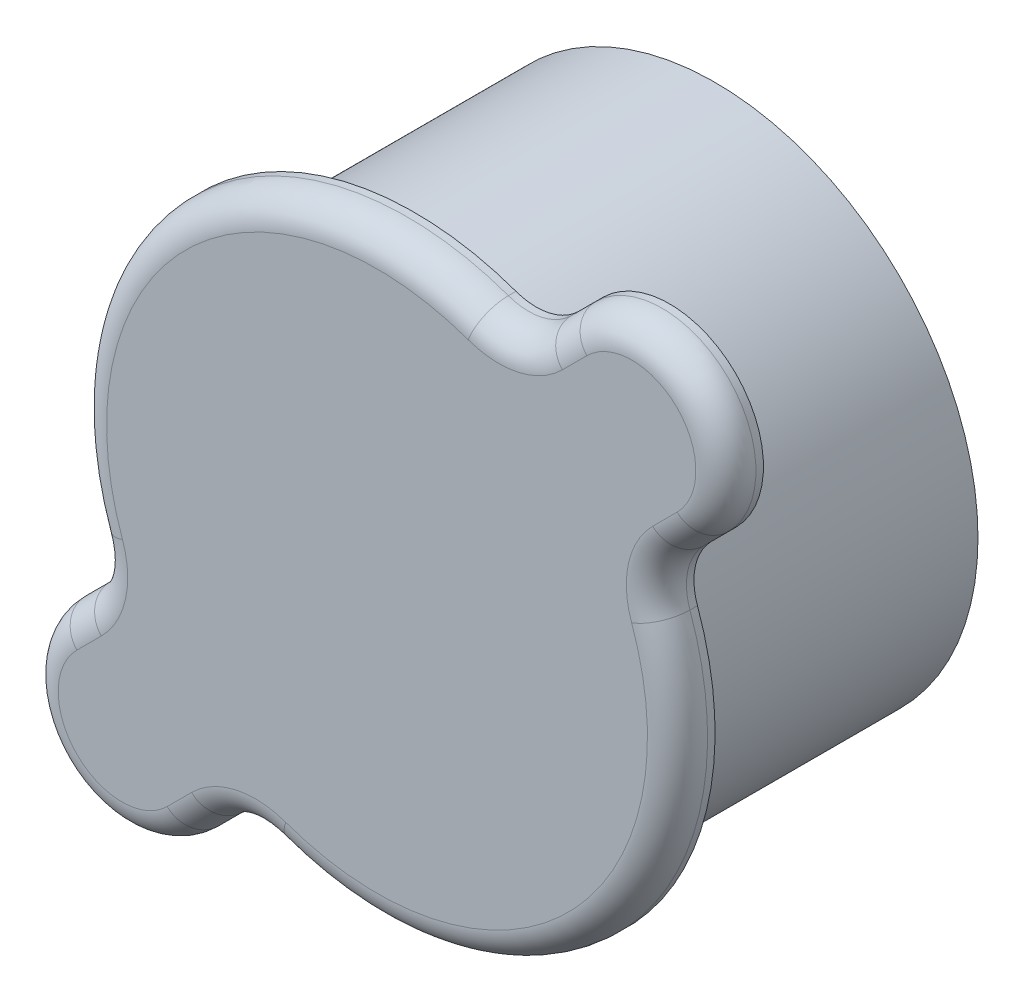
ISO-10303-21;
HEADER;
FILE_DESCRIPTION(('STEP AP214'),'2;1');
FILE_NAME('part.step','',(''),(''),'','','');
FILE_SCHEMA(('AUTOMOTIVE_DESIGN { 1 0 10303 214 1 1 1 1 }'));
ENDSEC;
DATA;
#1=APPLICATION_CONTEXT('core data for automotive mechanical design processes');
#2=APPLICATION_PROTOCOL_DEFINITION('international standard','automotive_design',2000,#1);
#3=PRODUCT_CONTEXT('',#1,'mechanical');
#4=PRODUCT('Part','Part','',(#3));
#5=PRODUCT_RELATED_PRODUCT_CATEGORY('part','',(#4));
#6=PRODUCT_DEFINITION_FORMATION('','',#4);
#7=PRODUCT_DEFINITION_CONTEXT('part definition',#1,'design');
#8=PRODUCT_DEFINITION('design','',#6,#7);
#9=PRODUCT_DEFINITION_SHAPE('','',#8);
#10=(LENGTH_UNIT() NAMED_UNIT(*) SI_UNIT(.MILLI.,.METRE.));
#11=(NAMED_UNIT(*) PLANE_ANGLE_UNIT() SI_UNIT($,.RADIAN.));
#12=(NAMED_UNIT(*) SI_UNIT($,.STERADIAN.) SOLID_ANGLE_UNIT());
#13=UNCERTAINTY_MEASURE_WITH_UNIT(LENGTH_MEASURE(1.E-05),#10,'distance_accuracy_value','');
#14=(GEOMETRIC_REPRESENTATION_CONTEXT(3) GLOBAL_UNCERTAINTY_ASSIGNED_CONTEXT((#13)) GLOBAL_UNIT_ASSIGNED_CONTEXT((#10,
#11,#12)) REPRESENTATION_CONTEXT('',''));
#15=CARTESIAN_POINT('',(0.,0.,0.));
#16=DIRECTION('',(0.,0.,1.));
#17=DIRECTION('',(1.,0.,0.));
#18=AXIS2_PLACEMENT_3D('',#15,#16,#17);
#19=CARTESIAN_POINT('',(5.61266007566834,-5.61266007566827,3.175));
#20=DIRECTION('',(-0.707106781186552,0.707106781186543,0.));
#21=DIRECTION('',(-0.707106781186543,-0.707106781186552,0.));
#22=AXIS2_PLACEMENT_3D('',#19,#20,#21);
#23=PLANE('',#22);
#24=DIRECTION('',(0.,0.,-1.));
#25=VECTOR('',#24,1.);
#26=CARTESIAN_POINT('',(27.1652747662342,15.9399546148978,3.175));
#27=LINE('',#26,#25);
#28=CARTESIAN_POINT('',(27.1652747662342,15.9399546148978,0.635));
#29=VERTEX_POINT('',#28);
#30=CARTESIAN_POINT('',(27.1652747662342,15.9399546148978,0.));
#31=VERTEX_POINT('',#30);
#32=EDGE_CURVE('E165',#29,#31,#27,.T.);
#33=ORIENTED_EDGE('',*,*,#32,.F.);
#34=DIRECTION('',(0.707106781186543,0.707106781186552,0.));
#35=VECTOR('',#34,1.);
#36=CARTESIAN_POINT('',(25.1007986957366,13.8754785444002,0.635));
#37=LINE('',#36,#35);
#38=CARTESIAN_POINT('',(25.1007986957366,13.8754785444002,0.635));
#39=VERTEX_POINT('',#38);
#40=EDGE_CURVE('E11',#29,#39,#37,.F.);
#41=ORIENTED_EDGE('',*,*,#40,.T.);
#42=DIRECTION('',(0.,0.,-1.));
#43=VECTOR('',#42,1.);
#44=CARTESIAN_POINT('',(25.1007986957366,13.8754785444002,3.175));
#45=LINE('',#44,#43);
#46=CARTESIAN_POINT('',(25.1007986957366,13.8754785444002,0.));
#47=VERTEX_POINT('',#46);
#48=EDGE_CURVE('E187',#39,#47,#45,.T.);
#49=ORIENTED_EDGE('',*,*,#48,.T.);
#50=DIRECTION('',(0.707106781186543,0.707106781186552,0.));
#51=VECTOR('',#50,1.);
#52=CARTESIAN_POINT('',(5.61266007566834,-5.61266007566827,0.));
#53=LINE('',#52,#51);
#54=EDGE_CURVE('E180',#47,#31,#53,.T.);
#55=ORIENTED_EDGE('',*,*,#54,.T.);
#56=EDGE_LOOP('',(#33,#41,#49,#55));
#57=FACE_BOUND('',#56,.T.);
#58=ADVANCED_FACE('F41',(#57),#23,.F.);
#59=CARTESIAN_POINT('',(21.5526146905659,21.552614690566,3.175));
#60=DIRECTION('',(0.,0.,-1.));
#61=DIRECTION('',(-1.,0.,0.));
#62=AXIS2_PLACEMENT_3D('',#59,#60,#61);
#63=CYLINDRICAL_SURFACE('',#62,7.9375);
#64=DIRECTION('',(0.,0.,-1.));
#65=VECTOR('',#64,1.);
#66=CARTESIAN_POINT('',(15.9399546148977,27.1652747662342,3.175));
#67=LINE('',#66,#65);
#68=CARTESIAN_POINT('',(15.9399546148977,27.1652747662342,0.635));
#69=VERTEX_POINT('',#68);
#70=CARTESIAN_POINT('',(15.9399546148977,27.1652747662342,0.));
#71=VERTEX_POINT('',#70);
#72=EDGE_CURVE('E174',#69,#71,#67,.T.);
#73=ORIENTED_EDGE('',*,*,#72,.F.);
#74=CARTESIAN_POINT('',(21.5526146905659,21.552614690566,0.635));
#75=DIRECTION('',(0.,0.,1.));
#76=DIRECTION('',(1.,0.,0.));
#77=AXIS2_PLACEMENT_3D('',#74,#75,#76);
#78=CIRCLE('',#77,7.9375);
#79=EDGE_CURVE('E50',#69,#29,#78,.F.);
#80=ORIENTED_EDGE('',*,*,#79,.T.);
#81=ORIENTED_EDGE('',*,*,#32,.T.);
#82=CARTESIAN_POINT('',(21.5526146905659,21.552614690566,0.));
#83=DIRECTION('',(0.,0.,1.));
#84=DIRECTION('',(1.,0.,0.));
#85=AXIS2_PLACEMENT_3D('',#82,#83,#84);
#86=CIRCLE('',#85,7.9375);
#87=EDGE_CURVE('E168',#31,#71,#86,.T.);
#88=ORIENTED_EDGE('',*,*,#87,.T.);
#89=EDGE_LOOP('',(#73,#80,#81,#88));
#90=FACE_BOUND('',#89,.T.);
#91=ADVANCED_FACE('F167',(#90),#63,.T.);
#92=CARTESIAN_POINT('',(-5.61266007566816,5.61266007566808,3.175));
#93=DIRECTION('',(0.707106781186552,-0.707106781186543,0.));
#94=DIRECTION('',(0.707106781186543,0.707106781186552,0.));
#95=AXIS2_PLACEMENT_3D('',#92,#93,#94);
#96=PLANE('',#95);
#97=DIRECTION('',(0.,0.,-1.));
#98=VECTOR('',#97,1.);
#99=CARTESIAN_POINT('',(13.8754785444001,25.1007986957366,3.175));
#100=LINE('',#99,#98);
#101=CARTESIAN_POINT('',(13.8754785444001,25.1007986957366,0.635));
#102=VERTEX_POINT('',#101);
#103=CARTESIAN_POINT('',(13.8754785444001,25.1007986957366,0.));
#104=VERTEX_POINT('',#103);
#105=EDGE_CURVE('E238',#102,#104,#100,.T.);
#106=ORIENTED_EDGE('',*,*,#105,.F.);
#107=DIRECTION('',(-0.707106781186543,-0.707106781186552,0.));
#108=VECTOR('',#107,1.);
#109=CARTESIAN_POINT('',(15.9399546148977,27.1652747662342,0.635));
#110=LINE('',#109,#108);
#111=EDGE_CURVE('E65',#102,#69,#110,.F.);
#112=ORIENTED_EDGE('',*,*,#111,.T.);
#113=ORIENTED_EDGE('',*,*,#72,.T.);
#114=DIRECTION('',(-0.707106781186543,-0.707106781186552,0.));
#115=VECTOR('',#114,1.);
#116=CARTESIAN_POINT('',(-5.61266007566816,5.61266007566808,0.));
#117=LINE('',#116,#115);
#118=EDGE_CURVE('E184',#71,#104,#117,.T.);
#119=ORIENTED_EDGE('',*,*,#118,.T.);
#120=EDGE_LOOP('',(#106,#112,#113,#119));
#121=FACE_BOUND('',#120,.T.);
#122=ADVANCED_FACE('F370',(#121),#96,.F.);
#123=CARTESIAN_POINT('',(10.2833760959724,28.6929011441643,3.175));
#124=DIRECTION('',(0.,0.,-1.));
#125=DIRECTION('',(-1.,0.,0.));
#126=AXIS2_PLACEMENT_3D('',#123,#124,#125);
#127=CYLINDRICAL_SURFACE('',#126,5.08);
#128=DIRECTION('',(0.,0.,-1.));
#129=VECTOR('',#128,1.);
#130=CARTESIAN_POINT('',(8.56948007997702,23.9107509534702,3.175));
#131=LINE('',#130,#129);
#132=CARTESIAN_POINT('',(8.56948007997702,23.9107509534702,0.635));
#133=VERTEX_POINT('',#132);
#134=CARTESIAN_POINT('',(8.56948007997702,23.9107509534702,0.));
#135=VERTEX_POINT('',#134);
#136=EDGE_CURVE('E236',#133,#135,#131,.T.);
#137=ORIENTED_EDGE('',*,*,#136,.F.);
#138=CARTESIAN_POINT('',(10.2833760959724,28.6929011441643,0.635));
#139=DIRECTION('',(0.,0.,1.));
#140=DIRECTION('',(1.,0.,0.));
#141=AXIS2_PLACEMENT_3D('',#138,#139,#140);
#142=CIRCLE('',#141,5.08);
#143=EDGE_CURVE('E282',#133,#102,#142,.T.);
#144=ORIENTED_EDGE('',*,*,#143,.T.);
#145=ORIENTED_EDGE('',*,*,#105,.T.);
#146=CARTESIAN_POINT('',(10.2833760959724,28.6929011441643,0.));
#147=DIRECTION('',(0.,0.,1.));
#148=DIRECTION('',(1.,0.,0.));
#149=AXIS2_PLACEMENT_3D('',#146,#147,#148);
#150=CIRCLE('',#149,5.08);
#151=EDGE_CURVE('E196',#135,#104,#150,.T.);
#152=ORIENTED_EDGE('',*,*,#151,.F.);
#153=EDGE_LOOP('',(#137,#144,#145,#152));
#154=FACE_BOUND('',#153,.T.);
#155=ADVANCED_FACE('F369',(#154),#127,.F.);
#156=CARTESIAN_POINT('',(0.,0.,3.175));
#157=DIRECTION('',(0.,0.,-1.));
#158=DIRECTION('',(-1.,0.,0.));
#159=AXIS2_PLACEMENT_3D('',#156,#157,#158);
#160=CYLINDRICAL_SURFACE('',#159,25.4);
#161=DIRECTION('',(0.,0.,-1.));
#162=VECTOR('',#161,1.);
#163=CARTESIAN_POINT('',(-23.9107509534702,-8.56948007997702,3.175));
#164=LINE('',#163,#162);
#165=CARTESIAN_POINT('',(-23.9107509534702,-8.56948007997702,0.635));
#166=VERTEX_POINT('',#165);
#167=CARTESIAN_POINT('',(-23.9107509534702,-8.56948007997702,0.));
#168=VERTEX_POINT('',#167);
#169=EDGE_CURVE('E234',#166,#168,#164,.T.);
#170=ORIENTED_EDGE('',*,*,#169,.F.);
#171=CARTESIAN_POINT('',(0.,0.,0.635));
#172=DIRECTION('',(0.,0.,1.));
#173=DIRECTION('',(1.,0.,0.));
#174=AXIS2_PLACEMENT_3D('',#171,#172,#173);
#175=CIRCLE('',#174,25.4);
#176=EDGE_CURVE('E280',#166,#133,#175,.F.);
#177=ORIENTED_EDGE('',*,*,#176,.T.);
#178=ORIENTED_EDGE('',*,*,#136,.T.);
#179=CARTESIAN_POINT('',(0.,0.,0.));
#180=DIRECTION('',(0.,0.,1.));
#181=DIRECTION('',(1.,0.,0.));
#182=AXIS2_PLACEMENT_3D('',#179,#180,#181);
#183=CIRCLE('',#182,25.4);
#184=EDGE_CURVE('E198',#135,#168,#183,.T.);
#185=ORIENTED_EDGE('',*,*,#184,.T.);
#186=EDGE_LOOP('',(#170,#177,#178,#185));
#187=FACE_BOUND('',#186,.T.);
#188=ADVANCED_FACE('F332',(#187),#160,.T.);
#189=CARTESIAN_POINT('',(-28.6929011441643,-10.2833760959724,3.175));
#190=DIRECTION('',(0.,0.,-1.));
#191=DIRECTION('',(-1.,0.,0.));
#192=AXIS2_PLACEMENT_3D('',#189,#190,#191);
#193=CYLINDRICAL_SURFACE('',#192,5.08);
#194=DIRECTION('',(0.,0.,-1.));
#195=VECTOR('',#194,1.);
#196=CARTESIAN_POINT('',(-25.1007986957366,-13.8754785444001,3.175));
#197=LINE('',#196,#195);
#198=CARTESIAN_POINT('',(-25.1007986957366,-13.8754785444001,0.635));
#199=VERTEX_POINT('',#198);
#200=CARTESIAN_POINT('',(-25.1007986957366,-13.8754785444001,0.));
#201=VERTEX_POINT('',#200);
#202=EDGE_CURVE('E232',#199,#201,#197,.T.);
#203=ORIENTED_EDGE('',*,*,#202,.F.);
#204=CARTESIAN_POINT('',(-28.6929011441643,-10.2833760959724,0.635));
#205=DIRECTION('',(0.,0.,1.));
#206=DIRECTION('',(1.,0.,0.));
#207=AXIS2_PLACEMENT_3D('',#204,#205,#206);
#208=CIRCLE('',#207,5.08);
#209=EDGE_CURVE('E278',#199,#166,#208,.T.);
#210=ORIENTED_EDGE('',*,*,#209,.T.);
#211=ORIENTED_EDGE('',*,*,#169,.T.);
#212=CARTESIAN_POINT('',(-28.6929011441643,-10.2833760959724,0.));
#213=DIRECTION('',(0.,0.,1.));
#214=DIRECTION('',(1.,0.,0.));
#215=AXIS2_PLACEMENT_3D('',#212,#213,#214);
#216=CIRCLE('',#215,5.08);
#217=EDGE_CURVE('E201',#201,#168,#216,.T.);
#218=ORIENTED_EDGE('',*,*,#217,.F.);
#219=EDGE_LOOP('',(#203,#210,#211,#218));
#220=FACE_BOUND('',#219,.T.);
#221=ADVANCED_FACE('F329',(#220),#193,.F.);
#222=CARTESIAN_POINT('',(-5.61266007566808,5.61266007566816,3.175));
#223=DIRECTION('',(0.707106781186543,-0.707106781186552,0.));
#224=DIRECTION('',(0.707106781186552,0.707106781186543,0.));
#225=AXIS2_PLACEMENT_3D('',#222,#223,#224);
#226=PLANE('',#225);
#227=DIRECTION('',(0.,0.,-1.));
#228=VECTOR('',#227,1.);
#229=CARTESIAN_POINT('',(-27.1652747662342,-15.9399546148977,3.175));
#230=LINE('',#229,#228);
#231=CARTESIAN_POINT('',(-27.1652747662342,-15.9399546148977,0.635));
#232=VERTEX_POINT('',#231);
#233=CARTESIAN_POINT('',(-27.1652747662342,-15.9399546148977,0.));
#234=VERTEX_POINT('',#233);
#235=EDGE_CURVE('E230',#232,#234,#230,.T.);
#236=ORIENTED_EDGE('',*,*,#235,.F.);
#237=DIRECTION('',(-0.707106781186552,-0.707106781186543,0.));
#238=VECTOR('',#237,1.);
#239=CARTESIAN_POINT('',(-25.1007986957366,-13.8754785444001,0.635));
#240=LINE('',#239,#238);
#241=EDGE_CURVE('E276',#232,#199,#240,.F.);
#242=ORIENTED_EDGE('',*,*,#241,.T.);
#243=ORIENTED_EDGE('',*,*,#202,.T.);
#244=DIRECTION('',(-0.707106781186552,-0.707106781186543,0.));
#245=VECTOR('',#244,1.);
#246=CARTESIAN_POINT('',(-5.61266007566808,5.61266007566816,0.));
#247=LINE('',#246,#245);
#248=EDGE_CURVE('E204',#201,#234,#247,.T.);
#249=ORIENTED_EDGE('',*,*,#248,.T.);
#250=EDGE_LOOP('',(#236,#242,#243,#249));
#251=FACE_BOUND('',#250,.T.);
#252=ADVANCED_FACE('F341',(#251),#226,.F.);
#253=CARTESIAN_POINT('',(-21.552614690566,-21.5526146905659,3.175));
#254=DIRECTION('',(0.,0.,-1.));
#255=DIRECTION('',(-1.,0.,0.));
#256=AXIS2_PLACEMENT_3D('',#253,#254,#255);
#257=CYLINDRICAL_SURFACE('',#256,7.9375);
#258=DIRECTION('',(0.,0.,-1.));
#259=VECTOR('',#258,1.);
#260=CARTESIAN_POINT('',(-15.9399546148978,-27.1652747662342,3.175));
#261=LINE('',#260,#259);
#262=CARTESIAN_POINT('',(-15.9399546148978,-27.1652747662342,0.635));
#263=VERTEX_POINT('',#262);
#264=CARTESIAN_POINT('',(-15.9399546148978,-27.1652747662342,0.));
#265=VERTEX_POINT('',#264);
#266=EDGE_CURVE('E228',#263,#265,#261,.T.);
#267=ORIENTED_EDGE('',*,*,#266,.F.);
#268=CARTESIAN_POINT('',(-21.552614690566,-21.5526146905659,0.635));
#269=DIRECTION('',(0.,0.,1.));
#270=DIRECTION('',(1.,0.,0.));
#271=AXIS2_PLACEMENT_3D('',#268,#269,#270);
#272=CIRCLE('',#271,7.9375);
#273=EDGE_CURVE('E274',#263,#232,#272,.F.);
#274=ORIENTED_EDGE('',*,*,#273,.T.);
#275=ORIENTED_EDGE('',*,*,#235,.T.);
#276=CARTESIAN_POINT('',(-21.552614690566,-21.5526146905659,0.));
#277=DIRECTION('',(0.,0.,1.));
#278=DIRECTION('',(1.,0.,0.));
#279=AXIS2_PLACEMENT_3D('',#276,#277,#278);
#280=CIRCLE('',#279,7.9375);
#281=EDGE_CURVE('E207',#234,#265,#280,.T.);
#282=ORIENTED_EDGE('',*,*,#281,.T.);
#283=EDGE_LOOP('',(#267,#274,#275,#282));
#284=FACE_BOUND('',#283,.T.);
#285=ADVANCED_FACE('F344',(#284),#257,.T.);
#286=CARTESIAN_POINT('',(5.61266007566826,-5.61266007566832,3.175));
#287=DIRECTION('',(-0.707106781186544,0.707106781186551,0.));
#288=DIRECTION('',(-0.707106781186551,-0.707106781186544,0.));
#289=AXIS2_PLACEMENT_3D('',#286,#287,#288);
#290=PLANE('',#289);
#291=DIRECTION('',(0.,0.,-1.));
#292=VECTOR('',#291,1.);
#293=CARTESIAN_POINT('',(-13.8754785444002,-25.1007986957366,3.175));
#294=LINE('',#293,#292);
#295=CARTESIAN_POINT('',(-13.8754785444002,-25.1007986957366,0.635));
#296=VERTEX_POINT('',#295);
#297=CARTESIAN_POINT('',(-13.8754785444002,-25.1007986957366,0.));
#298=VERTEX_POINT('',#297);
#299=EDGE_CURVE('E226',#296,#298,#294,.T.);
#300=ORIENTED_EDGE('',*,*,#299,.F.);
#301=DIRECTION('',(0.707106781186551,0.707106781186544,0.));
#302=VECTOR('',#301,1.);
#303=CARTESIAN_POINT('',(-15.9399546148978,-27.1652747662342,0.635));
#304=LINE('',#303,#302);
#305=EDGE_CURVE('E272',#296,#263,#304,.F.);
#306=ORIENTED_EDGE('',*,*,#305,.T.);
#307=ORIENTED_EDGE('',*,*,#266,.T.);
#308=DIRECTION('',(0.707106781186551,0.707106781186544,0.));
#309=VECTOR('',#308,1.);
#310=CARTESIAN_POINT('',(5.61266007566826,-5.61266007566832,0.));
#311=LINE('',#310,#309);
#312=EDGE_CURVE('E210',#265,#298,#311,.T.);
#313=ORIENTED_EDGE('',*,*,#312,.T.);
#314=EDGE_LOOP('',(#300,#306,#307,#313));
#315=FACE_BOUND('',#314,.T.);
#316=ADVANCED_FACE('F396',(#315),#290,.F.);
#317=CARTESIAN_POINT('',(-10.2833760959725,-28.6929011441642,3.175));
#318=DIRECTION('',(0.,0.,-1.));
#319=DIRECTION('',(-1.,0.,0.));
#320=AXIS2_PLACEMENT_3D('',#317,#318,#319);
#321=CYLINDRICAL_SURFACE('',#320,5.08);
#322=DIRECTION('',(0.,0.,-1.));
#323=VECTOR('',#322,1.);
#324=CARTESIAN_POINT('',(-8.5694800799771,-23.9107509534702,3.175));
#325=LINE('',#324,#323);
#326=CARTESIAN_POINT('',(-8.5694800799771,-23.9107509534702,0.635));
#327=VERTEX_POINT('',#326);
#328=CARTESIAN_POINT('',(-8.5694800799771,-23.9107509534702,0.));
#329=VERTEX_POINT('',#328);
#330=EDGE_CURVE('E224',#327,#329,#325,.T.);
#331=ORIENTED_EDGE('',*,*,#330,.F.);
#332=CARTESIAN_POINT('',(-10.2833760959725,-28.6929011441642,0.635));
#333=DIRECTION('',(0.,0.,1.));
#334=DIRECTION('',(1.,0.,0.));
#335=AXIS2_PLACEMENT_3D('',#332,#333,#334);
#336=CIRCLE('',#335,5.08);
#337=EDGE_CURVE('E270',#327,#296,#336,.T.);
#338=ORIENTED_EDGE('',*,*,#337,.T.);
#339=ORIENTED_EDGE('',*,*,#299,.T.);
#340=CARTESIAN_POINT('',(-10.2833760959725,-28.6929011441642,0.));
#341=DIRECTION('',(0.,0.,1.));
#342=DIRECTION('',(1.,0.,0.));
#343=AXIS2_PLACEMENT_3D('',#340,#341,#342);
#344=CIRCLE('',#343,5.08);
#345=EDGE_CURVE('E213',#329,#298,#344,.T.);
#346=ORIENTED_EDGE('',*,*,#345,.F.);
#347=EDGE_LOOP('',(#331,#338,#339,#346));
#348=FACE_BOUND('',#347,.T.);
#349=ADVANCED_FACE('F392',(#348),#321,.F.);
#350=CARTESIAN_POINT('',(0.,0.,3.175));
#351=DIRECTION('',(0.,0.,-1.));
#352=DIRECTION('',(-1.,0.,0.));
#353=AXIS2_PLACEMENT_3D('',#350,#351,#352);
#354=CYLINDRICAL_SURFACE('',#353,25.4);
#355=DIRECTION('',(0.,0.,-1.));
#356=VECTOR('',#355,1.);
#357=CARTESIAN_POINT('',(23.9107509534702,8.5694800799771,3.175));
#358=LINE('',#357,#356);
#359=CARTESIAN_POINT('',(23.9107509534702,8.5694800799771,0.635));
#360=VERTEX_POINT('',#359);
#361=CARTESIAN_POINT('',(23.9107509534702,8.5694800799771,0.));
#362=VERTEX_POINT('',#361);
#363=EDGE_CURVE('E222',#360,#362,#358,.T.);
#364=ORIENTED_EDGE('',*,*,#363,.F.);
#365=CARTESIAN_POINT('',(0.,0.,0.635));
#366=DIRECTION('',(0.,0.,1.));
#367=DIRECTION('',(1.,0.,0.));
#368=AXIS2_PLACEMENT_3D('',#365,#366,#367);
#369=CIRCLE('',#368,25.4);
#370=EDGE_CURVE('E268',#360,#327,#369,.F.);
#371=ORIENTED_EDGE('',*,*,#370,.T.);
#372=ORIENTED_EDGE('',*,*,#330,.T.);
#373=CARTESIAN_POINT('',(0.,0.,0.));
#374=DIRECTION('',(0.,0.,1.));
#375=DIRECTION('',(1.,0.,0.));
#376=AXIS2_PLACEMENT_3D('',#373,#374,#375);
#377=CIRCLE('',#376,25.4);
#378=EDGE_CURVE('E216',#329,#362,#377,.T.);
#379=ORIENTED_EDGE('',*,*,#378,.T.);
#380=EDGE_LOOP('',(#364,#371,#372,#379));
#381=FACE_BOUND('',#380,.T.);
#382=ADVANCED_FACE('F403',(#381),#354,.T.);
#383=CARTESIAN_POINT('',(28.6929011441642,10.2833760959725,3.175));
#384=DIRECTION('',(0.,0.,-1.));
#385=DIRECTION('',(-1.,0.,0.));
#386=AXIS2_PLACEMENT_3D('',#383,#384,#385);
#387=CYLINDRICAL_SURFACE('',#386,5.08);
#388=ORIENTED_EDGE('',*,*,#48,.F.);
#389=CARTESIAN_POINT('',(28.6929011441642,10.2833760959725,0.635));
#390=DIRECTION('',(0.,0.,1.));
#391=DIRECTION('',(1.,0.,0.));
#392=AXIS2_PLACEMENT_3D('',#389,#390,#391);
#393=CIRCLE('',#392,5.08);
#394=EDGE_CURVE('E173',#39,#360,#393,.T.);
#395=ORIENTED_EDGE('',*,*,#394,.T.);
#396=ORIENTED_EDGE('',*,*,#363,.T.);
#397=CARTESIAN_POINT('',(28.6929011441642,10.2833760959725,0.));
#398=DIRECTION('',(0.,0.,1.));
#399=DIRECTION('',(1.,0.,0.));
#400=AXIS2_PLACEMENT_3D('',#397,#398,#399);
#401=CIRCLE('',#400,5.08);
#402=EDGE_CURVE('E219',#47,#362,#401,.T.);
#403=ORIENTED_EDGE('',*,*,#402,.F.);
#404=EDGE_LOOP('',(#388,#395,#396,#403));
#405=FACE_BOUND('',#404,.T.);
#406=ADVANCED_FACE('F385',(#405),#387,.F.);
#407=CARTESIAN_POINT('',(0.,0.,3.175));
#408=DIRECTION('',(0.,0.,1.));
#409=DIRECTION('',(1.,0.,0.));
#410=AXIS2_PLACEMENT_3D('',#407,#408,#409);
#411=PLANE('',#410);
#412=CARTESIAN_POINT('',(0.,0.,3.175));
#413=DIRECTION('',(0.,0.,1.));
#414=DIRECTION('',(1.,0.,0.));
#415=AXIS2_PLACEMENT_3D('',#412,#413,#414);
#416=CIRCLE('',#415,22.86);
#417=CARTESIAN_POINT('',(-7.71253207197939,-21.5196758581232,3.175));
#418=VERTEX_POINT('',#417);
#419=CARTESIAN_POINT('',(21.5196758581232,7.71253207197939,3.175));
#420=VERTEX_POINT('',#419);
#421=EDGE_CURVE('E263',#418,#420,#416,.T.);
#422=ORIENTED_EDGE('',*,*,#421,.T.);
#423=CARTESIAN_POINT('',(28.6929011441642,10.2833760959725,3.175));
#424=DIRECTION('',(0.,0.,1.));
#425=DIRECTION('',(1.,0.,0.));
#426=AXIS2_PLACEMENT_3D('',#423,#424,#425);
#427=CIRCLE('',#426,7.62);
#428=CARTESIAN_POINT('',(23.3047474715227,15.671529768614,3.175));
#429=VERTEX_POINT('',#428);
#430=EDGE_CURVE('E265',#420,#429,#427,.F.);
#431=ORIENTED_EDGE('',*,*,#430,.T.);
#432=DIRECTION('',(0.707106781186543,0.707106781186552,0.));
#433=VECTOR('',#432,1.);
#434=CARTESIAN_POINT('',(25.3692235420203,17.7360058391116,3.175));
#435=LINE('',#434,#433);
#436=CARTESIAN_POINT('',(25.3692235420203,17.7360058391116,3.175));
#437=VERTEX_POINT('',#436);
#438=EDGE_CURVE('E243',#429,#437,#435,.T.);
#439=ORIENTED_EDGE('',*,*,#438,.T.);
#440=CARTESIAN_POINT('',(21.5526146905659,21.552614690566,3.175));
#441=DIRECTION('',(0.,0.,1.));
#442=DIRECTION('',(1.,0.,0.));
#443=AXIS2_PLACEMENT_3D('',#440,#441,#442);
#444=CIRCLE('',#443,5.3975);
#445=CARTESIAN_POINT('',(17.7360058391115,25.3692235420204,3.175));
#446=VERTEX_POINT('',#445);
#447=EDGE_CURVE('E245',#437,#446,#444,.T.);
#448=ORIENTED_EDGE('',*,*,#447,.T.);
#449=DIRECTION('',(-0.707106781186543,-0.707106781186552,0.));
#450=VECTOR('',#449,1.);
#451=CARTESIAN_POINT('',(15.6715297686139,23.3047474715228,3.175));
#452=LINE('',#451,#450);
#453=CARTESIAN_POINT('',(15.6715297686139,23.3047474715228,3.175));
#454=VERTEX_POINT('',#453);
#455=EDGE_CURVE('E247',#446,#454,#452,.T.);
#456=ORIENTED_EDGE('',*,*,#455,.T.);
#457=CARTESIAN_POINT('',(10.2833760959724,28.6929011441643,3.175));
#458=DIRECTION('',(0.,0.,1.));
#459=DIRECTION('',(1.,0.,0.));
#460=AXIS2_PLACEMENT_3D('',#457,#458,#459);
#461=CIRCLE('',#460,7.62000000000001);
#462=CARTESIAN_POINT('',(7.71253207197932,21.5196758581232,3.175));
#463=VERTEX_POINT('',#462);
#464=EDGE_CURVE('E249',#454,#463,#461,.F.);
#465=ORIENTED_EDGE('',*,*,#464,.T.);
#466=CARTESIAN_POINT('',(0.,0.,3.175));
#467=DIRECTION('',(0.,0.,1.));
#468=DIRECTION('',(1.,0.,0.));
#469=AXIS2_PLACEMENT_3D('',#466,#467,#468);
#470=CIRCLE('',#469,22.86);
#471=CARTESIAN_POINT('',(-21.5196758581232,-7.71253207197931,3.175));
#472=VERTEX_POINT('',#471);
#473=EDGE_CURVE('E251',#463,#472,#470,.T.);
#474=ORIENTED_EDGE('',*,*,#473,.T.);
#475=CARTESIAN_POINT('',(-28.6929011441643,-10.2833760959724,3.175));
#476=DIRECTION('',(0.,0.,1.));
#477=DIRECTION('',(1.,0.,0.));
#478=AXIS2_PLACEMENT_3D('',#475,#476,#477);
#479=CIRCLE('',#478,7.62);
#480=CARTESIAN_POINT('',(-23.3047474715228,-15.671529768614,3.175));
#481=VERTEX_POINT('',#480);
#482=EDGE_CURVE('E253',#472,#481,#479,.F.);
#483=ORIENTED_EDGE('',*,*,#482,.T.);
#484=DIRECTION('',(-0.707106781186552,-0.707106781186543,0.));
#485=VECTOR('',#484,1.);
#486=CARTESIAN_POINT('',(-25.3692235420204,-17.7360058391115,3.175));
#487=LINE('',#486,#485);
#488=CARTESIAN_POINT('',(-25.3692235420204,-17.7360058391115,3.175));
#489=VERTEX_POINT('',#488);
#490=EDGE_CURVE('E255',#481,#489,#487,.T.);
#491=ORIENTED_EDGE('',*,*,#490,.T.);
#492=CARTESIAN_POINT('',(-21.552614690566,-21.5526146905659,3.175));
#493=DIRECTION('',(0.,0.,1.));
#494=DIRECTION('',(1.,0.,0.));
#495=AXIS2_PLACEMENT_3D('',#492,#493,#494);
#496=CIRCLE('',#495,5.3975);
#497=CARTESIAN_POINT('',(-17.7360058391116,-25.3692235420203,3.175));
#498=VERTEX_POINT('',#497);
#499=EDGE_CURVE('E257',#489,#498,#496,.T.);
#500=ORIENTED_EDGE('',*,*,#499,.T.);
#501=DIRECTION('',(0.707106781186551,0.707106781186544,0.));
#502=VECTOR('',#501,1.);
#503=CARTESIAN_POINT('',(-15.671529768614,-23.3047474715227,3.175));
#504=LINE('',#503,#502);
#505=CARTESIAN_POINT('',(-15.671529768614,-23.3047474715227,3.175));
#506=VERTEX_POINT('',#505);
#507=EDGE_CURVE('E259',#498,#506,#504,.T.);
#508=ORIENTED_EDGE('',*,*,#507,.T.);
#509=CARTESIAN_POINT('',(-10.2833760959725,-28.6929011441642,3.175));
#510=DIRECTION('',(0.,0.,1.));
#511=DIRECTION('',(1.,0.,0.));
#512=AXIS2_PLACEMENT_3D('',#509,#510,#511);
#513=CIRCLE('',#512,7.62);
#514=EDGE_CURVE('E261',#506,#418,#513,.F.);
#515=ORIENTED_EDGE('',*,*,#514,.T.);
#516=EDGE_LOOP('',(#422,#431,#439,#448,#456,#465,#474,#483,#491,#500,#508,#515));
#517=FACE_BOUND('',#516,.T.);
#518=ADVANCED_FACE('F357',(#517),#411,.T.);
#519=CARTESIAN_POINT('',(0.,0.,0.));
#520=DIRECTION('',(0.,0.,1.));
#521=DIRECTION('',(1.,0.,0.));
#522=AXIS2_PLACEMENT_3D('',#519,#520,#521);
#523=PLANE('',#522);
#524=CARTESIAN_POINT('',(0.,0.,0.));
#525=DIRECTION('',(0.,0.,1.));
#526=DIRECTION('',(1.,0.,0.));
#527=AXIS2_PLACEMENT_3D('',#524,#525,#526);
#528=CIRCLE('',#527,22.225);
#529=CARTESIAN_POINT('',(22.225,0.,0.));
#530=VERTEX_POINT('',#529);
#531=EDGE_CURVE('E192',#530,#530,#528,.T.);
#532=ORIENTED_EDGE('',*,*,#531,.T.);
#533=EDGE_LOOP('',(#532));
#534=FACE_BOUND('',#533,.T.);
#535=ORIENTED_EDGE('',*,*,#54,.F.);
#536=ORIENTED_EDGE('',*,*,#402,.T.);
#537=ORIENTED_EDGE('',*,*,#378,.F.);
#538=ORIENTED_EDGE('',*,*,#345,.T.);
#539=ORIENTED_EDGE('',*,*,#312,.F.);
#540=ORIENTED_EDGE('',*,*,#281,.F.);
#541=ORIENTED_EDGE('',*,*,#248,.F.);
#542=ORIENTED_EDGE('',*,*,#217,.T.);
#543=ORIENTED_EDGE('',*,*,#184,.F.);
#544=ORIENTED_EDGE('',*,*,#151,.T.);
#545=ORIENTED_EDGE('',*,*,#118,.F.);
#546=ORIENTED_EDGE('',*,*,#87,.F.);
#547=EDGE_LOOP('',(#535,#536,#537,#538,#539,#540,#541,#542,#543,#544,#545,#546));
#548=FACE_BOUND('',#547,.T.);
#549=ADVANCED_FACE('F178',(#534,#548),#523,.F.);
#550=CARTESIAN_POINT('',(-28.6929011441643,-10.2833760959724,0.635));
#551=DIRECTION('',(0.,0.,1.));
#552=DIRECTION('',(1.,0.,0.));
#553=AXIS2_PLACEMENT_3D('',#550,#551,#552);
#554=TOROIDAL_SURFACE('',#553,7.62,2.54);
#555=CARTESIAN_POINT('',(-23.3047474715228,-15.671529768614,0.635));
#556=DIRECTION('',(-0.707106781186552,-0.707106781186543,0.));
#557=DIRECTION('',(0.707106781186543,-0.707106781186552,0.));
#558=AXIS2_PLACEMENT_3D('',#555,#556,#557);
#559=CIRCLE('',#558,2.54);
#560=EDGE_CURVE('E190',#481,#199,#559,.T.);
#561=ORIENTED_EDGE('',*,*,#560,.F.);
#562=ORIENTED_EDGE('',*,*,#482,.F.);
#563=CARTESIAN_POINT('',(-21.5196758581232,-7.71253207197931,0.635));
#564=DIRECTION('',(-0.33738110551091,0.941368147774417,0.));
#565=DIRECTION('',(-0.941368147774417,-0.33738110551091,0.));
#566=AXIS2_PLACEMENT_3D('',#563,#564,#565);
#567=CIRCLE('',#566,2.54);
#568=EDGE_CURVE('E45',#166,#472,#567,.T.);
#569=ORIENTED_EDGE('',*,*,#568,.F.);
#570=ORIENTED_EDGE('',*,*,#209,.F.);
#571=EDGE_LOOP('',(#561,#562,#569,#570));
#572=FACE_BOUND('',#571,.T.);
#573=ADVANCED_FACE('F43',(#572),#554,.T.);
#574=CARTESIAN_POINT('',(0.,0.,0.635));
#575=DIRECTION('',(0.,0.,1.));
#576=DIRECTION('',(1.,0.,0.));
#577=AXIS2_PLACEMENT_3D('',#574,#575,#576);
#578=TOROIDAL_SURFACE('',#577,22.86,2.54);
#579=ORIENTED_EDGE('',*,*,#568,.T.);
#580=ORIENTED_EDGE('',*,*,#473,.F.);
#581=CARTESIAN_POINT('',(7.71253207197932,21.5196758581232,0.635));
#582=DIRECTION('',(0.941368147774418,-0.337381105510906,0.));
#583=DIRECTION('',(0.337381105510906,0.941368147774418,0.));
#584=AXIS2_PLACEMENT_3D('',#581,#582,#583);
#585=CIRCLE('',#584,2.54);
#586=EDGE_CURVE('E312',#133,#463,#585,.T.);
#587=ORIENTED_EDGE('',*,*,#586,.F.);
#588=ORIENTED_EDGE('',*,*,#176,.F.);
#589=EDGE_LOOP('',(#579,#580,#587,#588));
#590=FACE_BOUND('',#589,.T.);
#591=ADVANCED_FACE('F363',(#590),#578,.T.);
#592=CARTESIAN_POINT('',(-3.81660885145426,3.81660885145431,0.635));
#593=DIRECTION('',(0.707106781186552,0.707106781186543,0.));
#594=DIRECTION('',(-0.707106781186543,0.707106781186552,0.));
#595=AXIS2_PLACEMENT_3D('',#592,#593,#594);
#596=CYLINDRICAL_SURFACE('',#595,2.54);
#597=ORIENTED_EDGE('',*,*,#560,.T.);
#598=ORIENTED_EDGE('',*,*,#241,.F.);
#599=CARTESIAN_POINT('',(-25.3692235420204,-17.7360058391115,0.635));
#600=DIRECTION('',(-0.707106781186549,-0.707106781186546,0.));
#601=DIRECTION('',(0.707106781186546,-0.707106781186549,0.));
#602=AXIS2_PLACEMENT_3D('',#599,#600,#601);
#603=CIRCLE('',#602,2.54);
#604=EDGE_CURVE('E309',#489,#232,#603,.T.);
#605=ORIENTED_EDGE('',*,*,#604,.F.);
#606=ORIENTED_EDGE('',*,*,#490,.F.);
#607=EDGE_LOOP('',(#597,#598,#605,#606));
#608=FACE_BOUND('',#607,.T.);
#609=ADVANCED_FACE('F319',(#608),#596,.T.);
#610=CARTESIAN_POINT('',(10.2833760959724,28.6929011441643,0.635));
#611=DIRECTION('',(0.,0.,1.));
#612=DIRECTION('',(1.,0.,0.));
#613=AXIS2_PLACEMENT_3D('',#610,#611,#612);
#614=TOROIDAL_SURFACE('',#613,7.62000000000001,2.54);
#615=ORIENTED_EDGE('',*,*,#586,.T.);
#616=ORIENTED_EDGE('',*,*,#464,.F.);
#617=CARTESIAN_POINT('',(15.6715297686139,23.3047474715228,0.635));
#618=DIRECTION('',(0.707106781186546,0.707106781186548,0.));
#619=DIRECTION('',(-0.707106781186549,0.707106781186547,0.));
#620=AXIS2_PLACEMENT_3D('',#617,#618,#619);
#621=CIRCLE('',#620,2.54);
#622=EDGE_CURVE('E306',#102,#454,#621,.T.);
#623=ORIENTED_EDGE('',*,*,#622,.F.);
#624=ORIENTED_EDGE('',*,*,#143,.F.);
#625=EDGE_LOOP('',(#615,#616,#623,#624));
#626=FACE_BOUND('',#625,.T.);
#627=ADVANCED_FACE('F366',(#626),#614,.T.);
#628=CARTESIAN_POINT('',(-21.552614690566,-21.5526146905659,0.635));
#629=DIRECTION('',(0.,0.,1.));
#630=DIRECTION('',(1.,0.,0.));
#631=AXIS2_PLACEMENT_3D('',#628,#629,#630);
#632=TOROIDAL_SURFACE('',#631,5.3975,2.54);
#633=ORIENTED_EDGE('',*,*,#604,.T.);
#634=ORIENTED_EDGE('',*,*,#273,.F.);
#635=CARTESIAN_POINT('',(-17.7360058391116,-25.3692235420203,0.635));
#636=DIRECTION('',(0.707106781186551,0.707106781186544,0.));
#637=DIRECTION('',(-0.707106781186544,0.707106781186551,0.));
#638=AXIS2_PLACEMENT_3D('',#635,#636,#637);
#639=CIRCLE('',#638,2.54);
#640=EDGE_CURVE('E303',#498,#263,#639,.T.);
#641=ORIENTED_EDGE('',*,*,#640,.F.);
#642=ORIENTED_EDGE('',*,*,#499,.F.);
#643=EDGE_LOOP('',(#633,#634,#641,#642));
#644=FACE_BOUND('',#643,.T.);
#645=ADVANCED_FACE('F348',(#644),#632,.T.);
#646=CARTESIAN_POINT('',(-3.81660885145432,3.81660885145427,0.635));
#647=DIRECTION('',(0.707106781186543,0.707106781186552,0.));
#648=DIRECTION('',(-0.707106781186552,0.707106781186543,0.));
#649=AXIS2_PLACEMENT_3D('',#646,#647,#648);
#650=CYLINDRICAL_SURFACE('',#649,2.54);
#651=ORIENTED_EDGE('',*,*,#622,.T.);
#652=ORIENTED_EDGE('',*,*,#455,.F.);
#653=CARTESIAN_POINT('',(17.7360058391115,25.3692235420204,0.635));
#654=DIRECTION('',(0.707106781186543,0.707106781186552,0.));
#655=DIRECTION('',(-0.707106781186552,0.707106781186543,0.));
#656=AXIS2_PLACEMENT_3D('',#653,#654,#655);
#657=CIRCLE('',#656,2.54);
#658=EDGE_CURVE('E300',#69,#446,#657,.T.);
#659=ORIENTED_EDGE('',*,*,#658,.F.);
#660=ORIENTED_EDGE('',*,*,#111,.F.);
#661=EDGE_LOOP('',(#651,#652,#659,#660));
#662=FACE_BOUND('',#661,.T.);
#663=ADVANCED_FACE('F374',(#662),#650,.T.);
#664=CARTESIAN_POINT('',(3.81660885145444,-3.81660885145448,0.635));
#665=DIRECTION('',(-0.707106781186551,-0.707106781186544,0.));
#666=DIRECTION('',(0.707106781186544,-0.707106781186551,0.));
#667=AXIS2_PLACEMENT_3D('',#664,#665,#666);
#668=CYLINDRICAL_SURFACE('',#667,2.54);
#669=ORIENTED_EDGE('',*,*,#640,.T.);
#670=ORIENTED_EDGE('',*,*,#305,.F.);
#671=CARTESIAN_POINT('',(-15.671529768614,-23.3047474715227,0.635));
#672=DIRECTION('',(0.707106781186546,0.707106781186549,0.));
#673=DIRECTION('',(-0.707106781186549,0.707106781186546,0.));
#674=AXIS2_PLACEMENT_3D('',#671,#672,#673);
#675=CIRCLE('',#674,2.54);
#676=EDGE_CURVE('E297',#506,#296,#675,.T.);
#677=ORIENTED_EDGE('',*,*,#676,.F.);
#678=ORIENTED_EDGE('',*,*,#507,.F.);
#679=EDGE_LOOP('',(#669,#670,#677,#678));
#680=FACE_BOUND('',#679,.T.);
#681=ADVANCED_FACE('F353',(#680),#668,.T.);
#682=CARTESIAN_POINT('',(21.5526146905659,21.552614690566,0.635));
#683=DIRECTION('',(0.,0.,1.));
#684=DIRECTION('',(1.,0.,0.));
#685=AXIS2_PLACEMENT_3D('',#682,#683,#684);
#686=TOROIDAL_SURFACE('',#685,5.3975,2.54);
#687=ORIENTED_EDGE('',*,*,#658,.T.);
#688=ORIENTED_EDGE('',*,*,#447,.F.);
#689=CARTESIAN_POINT('',(25.3692235420203,17.7360058391116,0.635));
#690=DIRECTION('',(-0.707106781186547,-0.707106781186548,0.));
#691=DIRECTION('',(0.707106781186548,-0.707106781186547,0.));
#692=AXIS2_PLACEMENT_3D('',#689,#690,#691);
#693=CIRCLE('',#692,2.54);
#694=EDGE_CURVE('E294',#29,#437,#693,.T.);
#695=ORIENTED_EDGE('',*,*,#694,.F.);
#696=ORIENTED_EDGE('',*,*,#79,.F.);
#697=EDGE_LOOP('',(#687,#688,#695,#696));
#698=FACE_BOUND('',#697,.T.);
#699=ADVANCED_FACE('F377',(#698),#686,.T.);
#700=CARTESIAN_POINT('',(-10.2833760959725,-28.6929011441642,0.635));
#701=DIRECTION('',(0.,0.,1.));
#702=DIRECTION('',(1.,0.,0.));
#703=AXIS2_PLACEMENT_3D('',#700,#701,#702);
#704=TOROIDAL_SURFACE('',#703,7.62,2.54);
#705=ORIENTED_EDGE('',*,*,#676,.T.);
#706=ORIENTED_EDGE('',*,*,#337,.F.);
#707=CARTESIAN_POINT('',(-7.71253207197939,-21.5196758581232,0.635));
#708=DIRECTION('',(0.941368147774417,-0.33738110551091,0.));
#709=DIRECTION('',(0.33738110551091,0.941368147774417,0.));
#710=AXIS2_PLACEMENT_3D('',#707,#708,#709);
#711=CIRCLE('',#710,2.54);
#712=EDGE_CURVE('E291',#418,#327,#711,.T.);
#713=ORIENTED_EDGE('',*,*,#712,.F.);
#714=ORIENTED_EDGE('',*,*,#514,.F.);
#715=EDGE_LOOP('',(#705,#706,#713,#714));
#716=FACE_BOUND('',#715,.T.);
#717=ADVANCED_FACE('F425',(#716),#704,.T.);
#718=CARTESIAN_POINT('',(3.8166088514545,-3.81660885145445,0.635));
#719=DIRECTION('',(-0.707106781186543,-0.707106781186552,0.));
#720=DIRECTION('',(0.707106781186552,-0.707106781186543,0.));
#721=AXIS2_PLACEMENT_3D('',#718,#719,#720);
#722=CYLINDRICAL_SURFACE('',#721,2.54);
#723=ORIENTED_EDGE('',*,*,#694,.T.);
#724=ORIENTED_EDGE('',*,*,#438,.F.);
#725=CARTESIAN_POINT('',(23.3047474715227,15.671529768614,0.635));
#726=DIRECTION('',(-0.707106781186543,-0.707106781186552,0.));
#727=DIRECTION('',(0.707106781186552,-0.707106781186543,0.));
#728=AXIS2_PLACEMENT_3D('',#725,#726,#727);
#729=CIRCLE('',#728,2.54);
#730=EDGE_CURVE('E288',#39,#429,#729,.T.);
#731=ORIENTED_EDGE('',*,*,#730,.F.);
#732=ORIENTED_EDGE('',*,*,#40,.F.);
#733=EDGE_LOOP('',(#723,#724,#731,#732));
#734=FACE_BOUND('',#733,.T.);
#735=ADVANCED_FACE('F382',(#734),#722,.T.);
#736=CARTESIAN_POINT('',(0.,0.,0.635));
#737=DIRECTION('',(0.,0.,1.));
#738=DIRECTION('',(1.,0.,0.));
#739=AXIS2_PLACEMENT_3D('',#736,#737,#738);
#740=TOROIDAL_SURFACE('',#739,22.86,2.54);
#741=ORIENTED_EDGE('',*,*,#712,.T.);
#742=ORIENTED_EDGE('',*,*,#370,.F.);
#743=CARTESIAN_POINT('',(21.5196758581232,7.71253207197939,0.635));
#744=DIRECTION('',(-0.337381105510911,0.941368147774417,0.));
#745=DIRECTION('',(-0.941368147774417,-0.337381105510911,0.));
#746=AXIS2_PLACEMENT_3D('',#743,#744,#745);
#747=CIRCLE('',#746,2.54);
#748=EDGE_CURVE('E286',#420,#360,#747,.T.);
#749=ORIENTED_EDGE('',*,*,#748,.F.);
#750=ORIENTED_EDGE('',*,*,#421,.F.);
#751=EDGE_LOOP('',(#741,#742,#749,#750));
#752=FACE_BOUND('',#751,.T.);
#753=ADVANCED_FACE('F418',(#752),#740,.T.);
#754=CARTESIAN_POINT('',(28.6929011441642,10.2833760959725,0.635));
#755=DIRECTION('',(0.,0.,1.));
#756=DIRECTION('',(1.,0.,0.));
#757=AXIS2_PLACEMENT_3D('',#754,#755,#756);
#758=TOROIDAL_SURFACE('',#757,7.62,2.54);
#759=ORIENTED_EDGE('',*,*,#730,.T.);
#760=ORIENTED_EDGE('',*,*,#430,.F.);
#761=ORIENTED_EDGE('',*,*,#748,.T.);
#762=ORIENTED_EDGE('',*,*,#394,.F.);
#763=EDGE_LOOP('',(#759,#760,#761,#762));
#764=FACE_BOUND('',#763,.T.);
#765=ADVANCED_FACE('F414',(#764),#758,.T.);
#766=CARTESIAN_POINT('',(0.,0.,-25.4));
#767=DIRECTION('',(0.,0.,1.));
#768=DIRECTION('',(1.,0.,0.));
#769=AXIS2_PLACEMENT_3D('',#766,#767,#768);
#770=CYLINDRICAL_SURFACE('',#769,22.225);
#771=CARTESIAN_POINT('',(0.,0.,-25.4));
#772=DIRECTION('',(0.,0.,1.));
#773=DIRECTION('',(1.,0.,0.));
#774=AXIS2_PLACEMENT_3D('',#771,#772,#773);
#775=CIRCLE('',#774,22.225);
#776=CARTESIAN_POINT('',(22.225,0.,-25.4));
#777=VERTEX_POINT('',#776);
#778=EDGE_CURVE('E289',#777,#777,#775,.T.);
#779=ORIENTED_EDGE('',*,*,#778,.T.);
#780=EDGE_LOOP('',(#779));
#781=FACE_BOUND('',#780,.T.);
#782=ORIENTED_EDGE('',*,*,#531,.F.);
#783=EDGE_LOOP('',(#782));
#784=FACE_BOUND('',#783,.T.);
#785=ADVANCED_FACE('F417',(#781,#784),#770,.T.);
#786=CARTESIAN_POINT('',(0.,0.,-25.4));
#787=DIRECTION('',(0.,0.,1.));
#788=DIRECTION('',(1.,0.,0.));
#789=AXIS2_PLACEMENT_3D('',#786,#787,#788);
#790=PLANE('',#789);
#791=ORIENTED_EDGE('',*,*,#778,.F.);
#792=EDGE_LOOP('',(#791));
#793=FACE_BOUND('',#792,.T.);
#794=ADVANCED_FACE('F559',(#793),#790,.F.);
#795=CLOSED_SHELL('',(#58,#91,#122,#155,#188,#221,#252,#285,#316,#349,#382,#406,#518,#549,#573,
#591,#609,#627,#645,#663,#681,#699,#717,#735,#753,#765,#785,#794));
#796=MANIFOLD_SOLID_BREP('B2',#795);
#797=ADVANCED_BREP_SHAPE_REPRESENTATION('',(#18,#796),#14);
#798=SHAPE_DEFINITION_REPRESENTATION(#9,#797);
ENDSEC;
END-ISO-10303-21;
